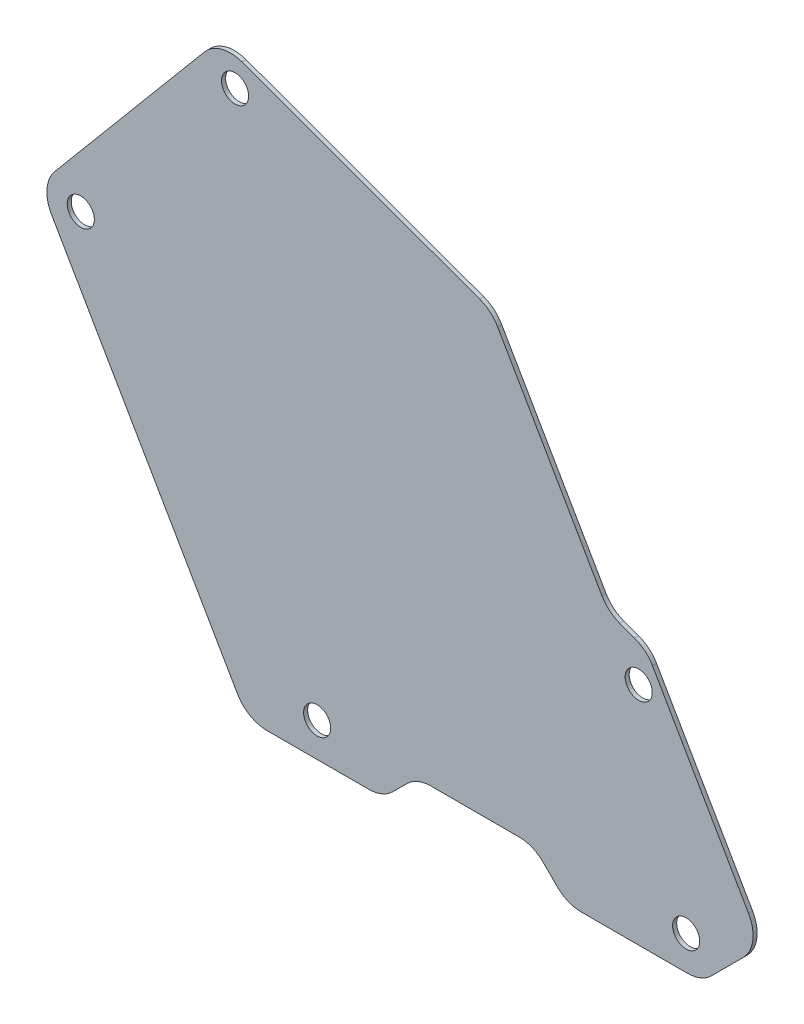
ISO-10303-21;
HEADER;
FILE_DESCRIPTION(('STEP AP214'),'2;1');
FILE_NAME('part.step','',(''),(''),'','','');
FILE_SCHEMA(('AUTOMOTIVE_DESIGN { 1 0 10303 214 1 1 1 1 }'));
ENDSEC;
DATA;
#1=APPLICATION_CONTEXT('core data for automotive mechanical design processes');
#2=APPLICATION_PROTOCOL_DEFINITION('international standard','automotive_design',2000,#1);
#3=PRODUCT_CONTEXT('',#1,'mechanical');
#4=PRODUCT('Part','Part','',(#3));
#5=PRODUCT_RELATED_PRODUCT_CATEGORY('part','',(#4));
#6=PRODUCT_DEFINITION_FORMATION('','',#4);
#7=PRODUCT_DEFINITION_CONTEXT('part definition',#1,'design');
#8=PRODUCT_DEFINITION('design','',#6,#7);
#9=PRODUCT_DEFINITION_SHAPE('','',#8);
#10=(LENGTH_UNIT() NAMED_UNIT(*) SI_UNIT(.MILLI.,.METRE.));
#11=(NAMED_UNIT(*) PLANE_ANGLE_UNIT() SI_UNIT($,.RADIAN.));
#12=(NAMED_UNIT(*) SI_UNIT($,.STERADIAN.) SOLID_ANGLE_UNIT());
#13=UNCERTAINTY_MEASURE_WITH_UNIT(LENGTH_MEASURE(1.E-05),#10,'distance_accuracy_value','');
#14=(GEOMETRIC_REPRESENTATION_CONTEXT(3) GLOBAL_UNCERTAINTY_ASSIGNED_CONTEXT((#13)) GLOBAL_UNIT_ASSIGNED_CONTEXT((#10,
#11,#12)) REPRESENTATION_CONTEXT('',''));
#15=CARTESIAN_POINT('',(0.,0.,0.));
#16=DIRECTION('',(0.,0.,1.));
#17=DIRECTION('',(1.,0.,0.));
#18=AXIS2_PLACEMENT_3D('',#15,#16,#17);
#19=CARTESIAN_POINT('',(332.038625304788,289.359909757789,3.));
#20=DIRECTION('',(0.342020143325669,0.939692620785908,0.));
#21=DIRECTION('',(-0.939692620785909,0.342020143325669,0.));
#22=AXIS2_PLACEMENT_3D('',#19,#20,#21);
#23=PLANE('',#22);
#24=DIRECTION('',(0.939692620785909,-0.342020143325669,0.));
#25=VECTOR('',#24,1.);
#26=CARTESIAN_POINT('',(332.038625304788,289.359909757789,3.));
#27=LINE('',#26,#25);
#28=CARTESIAN_POINT('',(-6.77904359740289,412.679456081648,3.));
#29=VERTEX_POINT('',#28);
#30=CARTESIAN_POINT('',(168.468991560186,348.894387670648,3.));
#31=VERTEX_POINT('',#30);
#32=EDGE_CURVE('E340',#29,#31,#27,.T.);
#33=ORIENTED_EDGE('',*,*,#32,.T.);
#34=DIRECTION('',(0.,0.,-1.));
#35=VECTOR('',#34,1.);
#36=CARTESIAN_POINT('',(168.468991560186,348.894387670648,3.));
#37=LINE('',#36,#35);
#38=CARTESIAN_POINT('',(168.468991560186,348.894387670648,0.));
#39=VERTEX_POINT('',#38);
#40=EDGE_CURVE('E215',#31,#39,#37,.T.);
#41=ORIENTED_EDGE('',*,*,#40,.T.);
#42=DIRECTION('',(0.939692620785909,-0.342020143325669,0.));
#43=VECTOR('',#42,1.);
#44=CARTESIAN_POINT('',(332.038625304788,289.359909757789,0.));
#45=LINE('',#44,#43);
#46=CARTESIAN_POINT('',(-6.77904359740289,412.679456081648,0.));
#47=VERTEX_POINT('',#46);
#48=EDGE_CURVE('E199',#47,#39,#45,.T.);
#49=ORIENTED_EDGE('',*,*,#48,.F.);
#50=DIRECTION('',(0.,0.,-1.));
#51=VECTOR('',#50,1.);
#52=CARTESIAN_POINT('',(-6.77904359740283,412.679456081648,3.));
#53=LINE('',#52,#51);
#54=EDGE_CURVE('E212',#47,#29,#53,.F.);
#55=ORIENTED_EDGE('',*,*,#54,.T.);
#56=EDGE_LOOP('',(#33,#41,#49,#55));
#57=FACE_BOUND('',#56,.T.);
#58=ADVANCED_FACE('F34',(#57),#23,.T.);
#59=CARTESIAN_POINT('',(-345.841153035783,34.1918425614465,3.));
#60=DIRECTION('',(-0.76604444311898,0.642787609686537,0.));
#61=DIRECTION('',(-0.642787609686537,-0.76604444311898,0.));
#62=AXIS2_PLACEMENT_3D('',#59,#60,#61);
#63=PLANE('',#62);
#64=DIRECTION('',(0.642787609686537,0.76604444311898,0.));
#65=VECTOR('',#64,1.);
#66=CARTESIAN_POINT('',(-345.841153035783,34.1918425614465,3.));
#67=LINE('',#66,#65);
#68=CARTESIAN_POINT('',(-144.82852762019,273.749361057275,3.));
#69=VERTEX_POINT('',#68);
#70=CARTESIAN_POINT('',(-34.480658258519,405.256830804164,3.));
#71=VERTEX_POINT('',#70);
#72=EDGE_CURVE('E341',#69,#71,#67,.T.);
#73=ORIENTED_EDGE('',*,*,#72,.T.);
#74=DIRECTION('',(0.,0.,-1.));
#75=VECTOR('',#74,1.);
#76=CARTESIAN_POINT('',(-34.480658258519,405.256830804164,3.));
#77=LINE('',#76,#75);
#78=CARTESIAN_POINT('',(-34.480658258519,405.256830804164,0.));
#79=VERTEX_POINT('',#78);
#80=EDGE_CURVE('E268',#71,#79,#77,.T.);
#81=ORIENTED_EDGE('',*,*,#80,.T.);
#82=DIRECTION('',(0.642787609686537,0.76604444311898,0.));
#83=VECTOR('',#82,1.);
#84=CARTESIAN_POINT('',(-345.841153035783,34.1918425614465,0.));
#85=LINE('',#84,#83);
#86=CARTESIAN_POINT('',(-144.82852762019,273.749361057275,0.));
#87=VERTEX_POINT('',#86);
#88=EDGE_CURVE('E201',#87,#79,#85,.T.);
#89=ORIENTED_EDGE('',*,*,#88,.F.);
#90=DIRECTION('',(0.,0.,-1.));
#91=VECTOR('',#90,1.);
#92=CARTESIAN_POINT('',(-144.82852762019,273.749361057275,3.));
#93=LINE('',#92,#91);
#94=EDGE_CURVE('E266',#87,#69,#93,.F.);
#95=ORIENTED_EDGE('',*,*,#94,.T.);
#96=EDGE_LOOP('',(#73,#81,#89,#95));
#97=FACE_BOUND('',#96,.T.);
#98=ADVANCED_FACE('F416',(#97),#63,.T.);
#99=CARTESIAN_POINT('',(169.267085877925,-303.179192789687,3.));
#100=DIRECTION('',(0.866025403784436,0.500000000000004,0.));
#101=DIRECTION('',(-0.500000000000004,0.866025403784436,0.));
#102=AXIS2_PLACEMENT_3D('',#99,#100,#101);
#103=PLANE('',#102);
#104=DIRECTION('',(0.500000000000004,-0.866025403784436,0.));
#105=VECTOR('',#104,1.);
#106=CARTESIAN_POINT('',(169.267085877925,-303.179192789687,0.));
#107=LINE('',#106,#105);
#108=CARTESIAN_POINT('',(-147.328051636826,245.179670815111,0.));
#109=VERTEX_POINT('',#108);
#110=CARTESIAN_POINT('',(-10.1036297108187,7.4999999999999,0.));
#111=VERTEX_POINT('',#110);
#112=EDGE_CURVE('E375',#109,#111,#107,.T.);
#113=ORIENTED_EDGE('',*,*,#112,.T.);
#114=DIRECTION('',(0.,0.,-1.));
#115=VECTOR('',#114,1.);
#116=CARTESIAN_POINT('',(-10.1036297108187,7.49999999999992,3.));
#117=LINE('',#116,#115);
#118=CARTESIAN_POINT('',(-10.1036297108187,7.4999999999999,3.));
#119=VERTEX_POINT('',#118);
#120=EDGE_CURVE('E278',#111,#119,#117,.F.);
#121=ORIENTED_EDGE('',*,*,#120,.T.);
#122=DIRECTION('',(0.500000000000004,-0.866025403784436,0.));
#123=VECTOR('',#122,1.);
#124=CARTESIAN_POINT('',(169.267085877925,-303.179192789687,3.));
#125=LINE('',#124,#123);
#126=CARTESIAN_POINT('',(-147.328051636826,245.179670815111,3.));
#127=VERTEX_POINT('',#126);
#128=EDGE_CURVE('E344',#127,#119,#125,.T.);
#129=ORIENTED_EDGE('',*,*,#128,.F.);
#130=DIRECTION('',(0.,0.,-1.));
#131=VECTOR('',#130,1.);
#132=CARTESIAN_POINT('',(-147.328051636826,245.179670815111,0.));
#133=LINE('',#132,#131);
#134=EDGE_CURVE('E275',#127,#109,#133,.T.);
#135=ORIENTED_EDGE('',*,*,#134,.T.);
#136=EDGE_LOOP('',(#113,#121,#129,#135));
#137=FACE_BOUND('',#136,.T.);
#138=ADVANCED_FACE('F421',(#137),#103,.F.);
#139=CARTESIAN_POINT('',(102.299593477973,-5.,3.));
#140=DIRECTION('',(0.,-1.,0.));
#141=DIRECTION('',(0.,0.,-1.));
#142=AXIS2_PLACEMENT_3D('',#139,#140,#141);
#143=PLANE('',#142);
#144=DIRECTION('',(-1.,0.,0.));
#145=VECTOR('',#144,1.);
#146=CARTESIAN_POINT('',(102.299593477973,-5.,3.));
#147=LINE('',#146,#145);
#148=CARTESIAN_POINT('',(86.7157287525381,-5.,3.));
#149=VERTEX_POINT('',#148);
#150=CARTESIAN_POINT('',(11.5470053837922,-5.,3.));
#151=VERTEX_POINT('',#150);
#152=EDGE_CURVE('E352',#149,#151,#147,.T.);
#153=ORIENTED_EDGE('',*,*,#152,.T.);
#154=DIRECTION('',(0.,0.,-1.));
#155=VECTOR('',#154,1.);
#156=CARTESIAN_POINT('',(11.5470053837922,-5.,0.));
#157=LINE('',#156,#155);
#158=CARTESIAN_POINT('',(11.5470053837922,-5.,0.));
#159=VERTEX_POINT('',#158);
#160=EDGE_CURVE('E272',#151,#159,#157,.T.);
#161=ORIENTED_EDGE('',*,*,#160,.T.);
#162=DIRECTION('',(-1.,0.,0.));
#163=VECTOR('',#162,1.);
#164=CARTESIAN_POINT('',(102.299593477973,-5.,0.));
#165=LINE('',#164,#163);
#166=CARTESIAN_POINT('',(86.7157287525381,-5.,0.));
#167=VERTEX_POINT('',#166);
#168=EDGE_CURVE('E378',#167,#159,#165,.T.);
#169=ORIENTED_EDGE('',*,*,#168,.F.);
#170=DIRECTION('',(0.,0.,-1.));
#171=VECTOR('',#170,1.);
#172=CARTESIAN_POINT('',(86.7157287525381,-5.,3.));
#173=LINE('',#172,#171);
#174=EDGE_CURVE('E270',#167,#149,#173,.F.);
#175=ORIENTED_EDGE('',*,*,#174,.T.);
#176=EDGE_LOOP('',(#153,#161,#169,#175));
#177=FACE_BOUND('',#176,.T.);
#178=ADVANCED_FACE('F492',(#177),#143,.T.);
#179=CARTESIAN_POINT('',(-68.736115631958,-170.807183443823,3.));
#180=DIRECTION('',(0.707106781186547,-0.707106781186548,0.));
#181=DIRECTION('',(0.707106781186548,0.707106781186547,0.));
#182=AXIS2_PLACEMENT_3D('',#179,#180,#181);
#183=PLANE('',#182);
#184=DIRECTION('',(-0.707106781186548,-0.707106781186547,0.));
#185=VECTOR('',#184,1.);
#186=CARTESIAN_POINT('',(-68.736115631958,-170.807183443823,0.));
#187=LINE('',#186,#185);
#188=CARTESIAN_POINT('',(114.748737341529,12.6776695296637,0.));
#189=VERTEX_POINT('',#188);
#190=CARTESIAN_POINT('',(104.393398282202,2.32233047033631,0.));
#191=VERTEX_POINT('',#190);
#192=EDGE_CURVE('E381',#189,#191,#187,.T.);
#193=ORIENTED_EDGE('',*,*,#192,.F.);
#194=DIRECTION('',(0.,0.,-1.));
#195=VECTOR('',#194,1.);
#196=CARTESIAN_POINT('',(114.748737341529,12.6776695296637,3.));
#197=LINE('',#196,#195);
#198=CARTESIAN_POINT('',(114.748737341529,12.6776695296637,3.));
#199=VERTEX_POINT('',#198);
#200=EDGE_CURVE('E288',#189,#199,#197,.F.);
#201=ORIENTED_EDGE('',*,*,#200,.T.);
#202=DIRECTION('',(-0.707106781186548,-0.707106781186547,0.));
#203=VECTOR('',#202,1.);
#204=CARTESIAN_POINT('',(-68.736115631958,-170.807183443823,3.));
#205=LINE('',#204,#203);
#206=CARTESIAN_POINT('',(104.393398282202,2.32233047033631,3.));
#207=VERTEX_POINT('',#206);
#208=EDGE_CURVE('E355',#199,#207,#205,.T.);
#209=ORIENTED_EDGE('',*,*,#208,.T.);
#210=DIRECTION('',(0.,0.,-1.));
#211=VECTOR('',#210,1.);
#212=CARTESIAN_POINT('',(104.393398282202,2.32233047033631,3.));
#213=LINE('',#212,#211);
#214=EDGE_CURVE('E285',#207,#191,#213,.T.);
#215=ORIENTED_EDGE('',*,*,#214,.T.);
#216=EDGE_LOOP('',(#193,#201,#209,#215));
#217=FACE_BOUND('',#216,.T.);
#218=ADVANCED_FACE('F485',(#217),#183,.T.);
#219=CARTESIAN_POINT('',(102.299593477973,20.,3.));
#220=DIRECTION('',(0.,-1.,0.));
#221=DIRECTION('',(0.,0.,-1.));
#222=AXIS2_PLACEMENT_3D('',#219,#220,#221);
#223=PLANE('',#222);
#224=DIRECTION('',(-1.,0.,0.));
#225=VECTOR('',#224,1.);
#226=CARTESIAN_POINT('',(102.299593477973,20.,3.));
#227=LINE('',#226,#225);
#228=CARTESIAN_POINT('',(197.573593128807,20.,3.));
#229=VERTEX_POINT('',#228);
#230=CARTESIAN_POINT('',(132.426406871193,20.,3.));
#231=VERTEX_POINT('',#230);
#232=EDGE_CURVE('E358',#229,#231,#227,.T.);
#233=ORIENTED_EDGE('',*,*,#232,.T.);
#234=DIRECTION('',(0.,0.,-1.));
#235=VECTOR('',#234,1.);
#236=CARTESIAN_POINT('',(132.426406871193,20.,0.));
#237=LINE('',#236,#235);
#238=CARTESIAN_POINT('',(132.426406871193,20.,0.));
#239=VERTEX_POINT('',#238);
#240=EDGE_CURVE('E282',#231,#239,#237,.T.);
#241=ORIENTED_EDGE('',*,*,#240,.T.);
#242=DIRECTION('',(-1.,0.,0.));
#243=VECTOR('',#242,1.);
#244=CARTESIAN_POINT('',(102.299593477973,20.,0.));
#245=LINE('',#244,#243);
#246=CARTESIAN_POINT('',(197.573593128807,20.,0.));
#247=VERTEX_POINT('',#246);
#248=EDGE_CURVE('E384',#247,#239,#245,.T.);
#249=ORIENTED_EDGE('',*,*,#248,.F.);
#250=DIRECTION('',(0.,0.,-1.));
#251=VECTOR('',#250,1.);
#252=CARTESIAN_POINT('',(197.573593128807,20.,3.));
#253=LINE('',#252,#251);
#254=EDGE_CURVE('E280',#247,#229,#253,.F.);
#255=ORIENTED_EDGE('',*,*,#254,.T.);
#256=EDGE_LOOP('',(#233,#241,#249,#255));
#257=FACE_BOUND('',#256,.T.);
#258=ADVANCED_FACE('F478',(#257),#223,.T.);
#259=CARTESIAN_POINT('',(336.035709109931,-108.106776921796,3.));
#260=DIRECTION('',(0.707106781186547,0.707106781186548,0.));
#261=DIRECTION('',(-0.707106781186548,0.707106781186547,0.));
#262=AXIS2_PLACEMENT_3D('',#259,#260,#261);
#263=PLANE('',#262);
#264=DIRECTION('',(0.707106781186548,-0.707106781186547,0.));
#265=VECTOR('',#264,1.);
#266=CARTESIAN_POINT('',(336.035709109931,-108.106776921796,3.));
#267=LINE('',#266,#265);
#268=CARTESIAN_POINT('',(215.251262658471,12.6776695296637,3.));
#269=VERTEX_POINT('',#268);
#270=CARTESIAN_POINT('',(225.606601717798,2.32233047033632,3.));
#271=VERTEX_POINT('',#270);
#272=EDGE_CURVE('E361',#269,#271,#267,.T.);
#273=ORIENTED_EDGE('',*,*,#272,.F.);
#274=DIRECTION('',(0.,0.,-1.));
#275=VECTOR('',#274,1.);
#276=CARTESIAN_POINT('',(215.251262658471,12.6776695296637,3.));
#277=LINE('',#276,#275);
#278=CARTESIAN_POINT('',(215.251262658471,12.6776695296637,0.));
#279=VERTEX_POINT('',#278);
#280=EDGE_CURVE('E292',#269,#279,#277,.T.);
#281=ORIENTED_EDGE('',*,*,#280,.T.);
#282=DIRECTION('',(0.707106781186548,-0.707106781186547,0.));
#283=VECTOR('',#282,1.);
#284=CARTESIAN_POINT('',(336.035709109931,-108.106776921796,0.));
#285=LINE('',#284,#283);
#286=CARTESIAN_POINT('',(225.606601717798,2.32233047033632,0.));
#287=VERTEX_POINT('',#286);
#288=EDGE_CURVE('E387',#279,#287,#285,.T.);
#289=ORIENTED_EDGE('',*,*,#288,.T.);
#290=DIRECTION('',(0.,0.,-1.));
#291=VECTOR('',#290,1.);
#292=CARTESIAN_POINT('',(225.606601717798,2.32233047033629,3.));
#293=LINE('',#292,#291);
#294=EDGE_CURVE('E290',#287,#271,#293,.F.);
#295=ORIENTED_EDGE('',*,*,#294,.T.);
#296=EDGE_LOOP('',(#273,#281,#289,#295));
#297=FACE_BOUND('',#296,.T.);
#298=ADVANCED_FACE('F472',(#297),#263,.F.);
#299=CARTESIAN_POINT('',(102.299593477973,-5.,3.));
#300=DIRECTION('',(0.,-1.,0.));
#301=DIRECTION('',(1.,0.,0.));
#302=AXIS2_PLACEMENT_3D('',#299,#300,#301);
#303=PLANE('',#302);
#304=DIRECTION('',(-1.,0.,0.));
#305=VECTOR('',#304,1.);
#306=CARTESIAN_POINT('',(102.299593477973,-5.,3.));
#307=LINE('',#306,#305);
#308=CARTESIAN_POINT('',(321.715728752538,-5.,3.));
#309=VERTEX_POINT('',#308);
#310=CARTESIAN_POINT('',(243.284271247462,-5.,3.));
#311=VERTEX_POINT('',#310);
#312=EDGE_CURVE('E364',#309,#311,#307,.T.);
#313=ORIENTED_EDGE('',*,*,#312,.T.);
#314=DIRECTION('',(0.,0.,-1.));
#315=VECTOR('',#314,1.);
#316=CARTESIAN_POINT('',(243.284271247462,-5.,0.));
#317=LINE('',#316,#315);
#318=CARTESIAN_POINT('',(243.284271247462,-5.,0.));
#319=VERTEX_POINT('',#318);
#320=EDGE_CURVE('E297',#311,#319,#317,.T.);
#321=ORIENTED_EDGE('',*,*,#320,.T.);
#322=DIRECTION('',(-1.,0.,0.));
#323=VECTOR('',#322,1.);
#324=CARTESIAN_POINT('',(102.299593477973,-5.,0.));
#325=LINE('',#324,#323);
#326=CARTESIAN_POINT('',(321.715728752538,-5.,0.));
#327=VERTEX_POINT('',#326);
#328=EDGE_CURVE('E390',#327,#319,#325,.T.);
#329=ORIENTED_EDGE('',*,*,#328,.F.);
#330=DIRECTION('',(0.,0.,-1.));
#331=VECTOR('',#330,1.);
#332=CARTESIAN_POINT('',(321.715728752538,-5.,3.));
#333=LINE('',#332,#331);
#334=EDGE_CURVE('E295',#327,#309,#333,.F.);
#335=ORIENTED_EDGE('',*,*,#334,.T.);
#336=EDGE_LOOP('',(#313,#321,#329,#335));
#337=FACE_BOUND('',#336,.T.);
#338=ADVANCED_FACE('F465',(#337),#303,.T.);
#339=CARTESIAN_POINT('',(48.763884368042,-288.307183443823,3.));
#340=DIRECTION('',(0.707106781186547,-0.707106781186547,0.));
#341=DIRECTION('',(0.707106781186548,0.707106781186548,0.));
#342=AXIS2_PLACEMENT_3D('',#339,#340,#341);
#343=PLANE('',#342);
#344=DIRECTION('',(-0.707106781186548,-0.707106781186548,0.));
#345=VECTOR('',#344,1.);
#346=CARTESIAN_POINT('',(48.763884368042,-288.307183443823,3.));
#347=LINE('',#346,#345);
#348=CARTESIAN_POINT('',(362.683891574185,25.6128237623193,3.));
#349=VERTEX_POINT('',#348);
#350=CARTESIAN_POINT('',(339.393398282202,2.32233047033636,3.));
#351=VERTEX_POINT('',#350);
#352=EDGE_CURVE('E367',#349,#351,#347,.T.);
#353=ORIENTED_EDGE('',*,*,#352,.T.);
#354=DIRECTION('',(0.,0.,-1.));
#355=VECTOR('',#354,1.);
#356=CARTESIAN_POINT('',(339.393398282202,2.32233047033631,3.));
#357=LINE('',#356,#355);
#358=CARTESIAN_POINT('',(339.393398282202,2.32233047033636,0.));
#359=VERTEX_POINT('',#358);
#360=EDGE_CURVE('E302',#351,#359,#357,.T.);
#361=ORIENTED_EDGE('',*,*,#360,.T.);
#362=DIRECTION('',(-0.707106781186548,-0.707106781186548,0.));
#363=VECTOR('',#362,1.);
#364=CARTESIAN_POINT('',(48.763884368042,-288.307183443823,0.));
#365=LINE('',#364,#363);
#366=CARTESIAN_POINT('',(362.683891574185,25.6128237623193,0.));
#367=VERTEX_POINT('',#366);
#368=EDGE_CURVE('E393',#367,#359,#365,.T.);
#369=ORIENTED_EDGE('',*,*,#368,.F.);
#370=DIRECTION('',(0.,0.,-1.));
#371=VECTOR('',#370,1.);
#372=CARTESIAN_POINT('',(362.683891574185,25.6128237623192,3.));
#373=LINE('',#372,#371);
#374=EDGE_CURVE('E300',#367,#349,#373,.F.);
#375=ORIENTED_EDGE('',*,*,#374,.T.);
#376=EDGE_LOOP('',(#353,#361,#369,#375));
#377=FACE_BOUND('',#376,.T.);
#378=ADVANCED_FACE('F461',(#377),#343,.T.);
#379=CARTESIAN_POINT('',(472.747847991456,-127.964493089567,3.));
#380=DIRECTION('',(0.866025403784438,0.5,0.));
#381=DIRECTION('',(-0.5,0.866025403784439,0.));
#382=AXIS2_PLACEMENT_3D('',#379,#380,#381);
#383=PLANE('',#382);
#384=DIRECTION('',(0.5,-0.866025403784438,0.));
#385=VECTOR('',#384,1.);
#386=CARTESIAN_POINT('',(472.747847991456,-127.964493089567,3.));
#387=LINE('',#386,#385);
#388=CARTESIAN_POINT('',(295.799341808877,178.519309942074,3.));
#389=VERTEX_POINT('',#388);
#390=CARTESIAN_POINT('',(366.656857139132,55.7904932919829,3.));
#391=VERTEX_POINT('',#390);
#392=EDGE_CURVE('E370',#389,#391,#387,.T.);
#393=ORIENTED_EDGE('',*,*,#392,.T.);
#394=DIRECTION('',(0.,0.,-1.));
#395=VECTOR('',#394,1.);
#396=CARTESIAN_POINT('',(366.656857139132,55.790493291983,3.));
#397=LINE('',#396,#395);
#398=CARTESIAN_POINT('',(366.656857139132,55.7904932919829,0.));
#399=VERTEX_POINT('',#398);
#400=EDGE_CURVE('E307',#391,#399,#397,.T.);
#401=ORIENTED_EDGE('',*,*,#400,.T.);
#402=DIRECTION('',(0.5,-0.866025403784438,0.));
#403=VECTOR('',#402,1.);
#404=CARTESIAN_POINT('',(472.747847991456,-127.964493089567,0.));
#405=LINE('',#404,#403);
#406=CARTESIAN_POINT('',(295.799341808877,178.519309942074,0.));
#407=VERTEX_POINT('',#406);
#408=EDGE_CURVE('E329',#407,#399,#405,.T.);
#409=ORIENTED_EDGE('',*,*,#408,.F.);
#410=DIRECTION('',(0.,0.,-1.));
#411=VECTOR('',#410,1.);
#412=CARTESIAN_POINT('',(295.799341808877,178.519309942074,3.));
#413=LINE('',#412,#411);
#414=EDGE_CURVE('E305',#407,#389,#413,.F.);
#415=ORIENTED_EDGE('',*,*,#414,.T.);
#416=EDGE_LOOP('',(#393,#401,#409,#415));
#417=FACE_BOUND('',#416,.T.);
#418=ADVANCED_FACE('F401',(#417),#383,.T.);
#419=CARTESIAN_POINT('',(294.176390150685,185.334273621809,3.));
#420=DIRECTION('',(0.342020143325669,0.939692620785908,0.));
#421=DIRECTION('',(-0.939692620785909,0.342020143325669,0.));
#422=AXIS2_PLACEMENT_3D('',#419,#420,#421);
#423=PLANE('',#422);
#424=DIRECTION('',(0.939692620785909,-0.342020143325669,0.));
#425=VECTOR('',#424,1.);
#426=CARTESIAN_POINT('',(294.176390150685,185.334273621809,3.));
#427=LINE('',#426,#425);
#428=CARTESIAN_POINT('',(271.680689159319,193.522039181619,3.));
#429=VERTEX_POINT('',#428);
#430=CARTESIAN_POINT('',(282.699210297408,189.511625461722,3.));
#431=VERTEX_POINT('',#430);
#432=EDGE_CURVE('E226',#429,#431,#427,.T.);
#433=ORIENTED_EDGE('',*,*,#432,.T.);
#434=DIRECTION('',(0.,0.,-1.));
#435=VECTOR('',#434,1.);
#436=CARTESIAN_POINT('',(282.699210297408,189.511625461722,3.));
#437=LINE('',#436,#435);
#438=CARTESIAN_POINT('',(282.699210297408,189.511625461722,0.));
#439=VERTEX_POINT('',#438);
#440=EDGE_CURVE('E311',#431,#439,#437,.T.);
#441=ORIENTED_EDGE('',*,*,#440,.T.);
#442=DIRECTION('',(0.939692620785909,-0.342020143325669,0.));
#443=VECTOR('',#442,1.);
#444=CARTESIAN_POINT('',(294.176390150685,185.334273621809,0.));
#445=LINE('',#444,#443);
#446=CARTESIAN_POINT('',(271.680689159319,193.522039181619,0.));
#447=VERTEX_POINT('',#446);
#448=EDGE_CURVE('E323',#447,#439,#445,.T.);
#449=ORIENTED_EDGE('',*,*,#448,.F.);
#450=DIRECTION('',(0.,0.,-1.));
#451=VECTOR('',#450,1.);
#452=CARTESIAN_POINT('',(271.680689159319,193.522039181619,3.));
#453=LINE('',#452,#451);
#454=EDGE_CURVE('E56',#447,#429,#453,.F.);
#455=ORIENTED_EDGE('',*,*,#454,.T.);
#456=EDGE_LOOP('',(#433,#441,#449,#455));
#457=FACE_BOUND('',#456,.T.);
#458=ADVANCED_FACE('F327',(#457),#423,.T.);
#459=CARTESIAN_POINT('',(456.089944437673,-137.581938190476,3.));
#460=DIRECTION('',(0.866025403784436,0.500000000000004,0.));
#461=DIRECTION('',(-0.500000000000004,0.866025403784436,0.));
#462=AXIS2_PLACEMENT_3D('',#459,#460,#461);
#463=PLANE('',#462);
#464=DIRECTION('',(0.500000000000004,-0.866025403784436,0.));
#465=VECTOR('',#464,1.);
#466=CARTESIAN_POINT('',(456.089944437673,-137.581938190476,0.));
#467=LINE('',#466,#465);
#468=CARTESIAN_POINT('',(181.569123071656,337.902072151001,0.));
#469=VERTEX_POINT('',#468);
#470=CARTESIAN_POINT('',(258.58055764785,204.514354701267,0.));
#471=VERTEX_POINT('',#470);
#472=EDGE_CURVE('E229',#469,#471,#467,.T.);
#473=ORIENTED_EDGE('',*,*,#472,.F.);
#474=DIRECTION('',(0.,0.,-1.));
#475=VECTOR('',#474,1.);
#476=CARTESIAN_POINT('',(181.569123071656,337.902072151001,3.));
#477=LINE('',#476,#475);
#478=CARTESIAN_POINT('',(181.569123071656,337.902072151001,3.));
#479=VERTEX_POINT('',#478);
#480=EDGE_CURVE('E248',#469,#479,#477,.F.);
#481=ORIENTED_EDGE('',*,*,#480,.T.);
#482=DIRECTION('',(0.500000000000004,-0.866025403784436,0.));
#483=VECTOR('',#482,1.);
#484=CARTESIAN_POINT('',(456.089944437673,-137.581938190476,3.));
#485=LINE('',#484,#483);
#486=CARTESIAN_POINT('',(258.58055764785,204.514354701267,3.));
#487=VERTEX_POINT('',#486);
#488=EDGE_CURVE('E221',#479,#487,#485,.T.);
#489=ORIENTED_EDGE('',*,*,#488,.T.);
#490=DIRECTION('',(0.,0.,-1.));
#491=VECTOR('',#490,1.);
#492=CARTESIAN_POINT('',(258.58055764785,204.514354701267,0.));
#493=LINE('',#492,#491);
#494=EDGE_CURVE('E245',#487,#471,#493,.T.);
#495=ORIENTED_EDGE('',*,*,#494,.T.);
#496=EDGE_LOOP('',(#473,#481,#489,#495));
#497=FACE_BOUND('',#496,.T.);
#498=ADVANCED_FACE('F336',(#497),#463,.T.);
#499=CARTESIAN_POINT('',(102.299593477973,-341.842892553754,3.));
#500=DIRECTION('',(0.,0.,1.));
#501=DIRECTION('',(1.,0.,0.));
#502=AXIS2_PLACEMENT_3D('',#499,#500,#501);
#503=PLANE('',#502);
#504=CARTESIAN_POINT('',(285.6738468369,161.319502664671,3.));
#505=DIRECTION('',(0.,0.,-1.));
#506=DIRECTION('',(-1.,0.,0.));
#507=AXIS2_PLACEMENT_3D('',#504,#505,#506);
#508=CIRCLE('',#507,10.);
#509=CARTESIAN_POINT('',(275.6738468369,161.319502664671,3.));
#510=VERTEX_POINT('',#509);
#511=EDGE_CURVE('E692',#510,#510,#508,.T.);
#512=ORIENTED_EDGE('',*,*,#511,.T.);
#513=EDGE_LOOP('',(#512));
#514=FACE_BOUND('',#513,.T.);
#515=CARTESIAN_POINT('',(320.6738468369,20.,3.));
#516=DIRECTION('',(0.,0.,-1.));
#517=DIRECTION('',(-1.,0.,0.));
#518=AXIS2_PLACEMENT_3D('',#515,#516,#517);
#519=CIRCLE('',#518,9.99999999999998);
#520=CARTESIAN_POINT('',(310.6738468369,20.,3.));
#521=VERTEX_POINT('',#520);
#522=EDGE_CURVE('E700',#521,#521,#519,.T.);
#523=ORIENTED_EDGE('',*,*,#522,.T.);
#524=EDGE_LOOP('',(#523));
#525=FACE_BOUND('',#524,.T.);
#526=CARTESIAN_POINT('',(48.610426110346,20.,3.));
#527=DIRECTION('',(0.,0.,-1.));
#528=DIRECTION('',(-1.,0.,0.));
#529=AXIS2_PLACEMENT_3D('',#526,#527,#528);
#530=CIRCLE('',#529,10.);
#531=CARTESIAN_POINT('',(38.610426110346,20.,3.));
#532=VERTEX_POINT('',#531);
#533=EDGE_CURVE('E706',#532,#532,#530,.T.);
#534=ORIENTED_EDGE('',*,*,#533,.T.);
#535=EDGE_LOOP('',(#534));
#536=FACE_BOUND('',#535,.T.);
#537=CARTESIAN_POINT('',(-125.677416542216,257.679670815111,3.));
#538=DIRECTION('',(0.,0.,-1.));
#539=DIRECTION('',(-1.,0.,0.));
#540=AXIS2_PLACEMENT_3D('',#537,#538,#539);
#541=CIRCLE('',#540,10.);
#542=CARTESIAN_POINT('',(-135.677416542216,257.679670815111,3.));
#543=VERTEX_POINT('',#542);
#544=EDGE_CURVE('E712',#543,#543,#541,.T.);
#545=ORIENTED_EDGE('',*,*,#544,.T.);
#546=EDGE_LOOP('',(#545));
#547=FACE_BOUND('',#546,.T.);
#548=CARTESIAN_POINT('',(-11.9093457472882,393.26317790748,3.));
#549=DIRECTION('',(0.,0.,-1.));
#550=DIRECTION('',(-1.,0.,0.));
#551=AXIS2_PLACEMENT_3D('',#548,#549,#550);
#552=CIRCLE('',#551,10.);
#553=CARTESIAN_POINT('',(-21.9093457472882,393.26317790748,3.));
#554=VERTEX_POINT('',#553);
#555=EDGE_CURVE('E216',#554,#554,#552,.T.);
#556=ORIENTED_EDGE('',*,*,#555,.T.);
#557=EDGE_LOOP('',(#556));
#558=FACE_BOUND('',#557,.T.);
#559=ORIENTED_EDGE('',*,*,#488,.F.);
#560=CARTESIAN_POINT('',(159.918487977045,325.402072151001,3.));
#561=DIRECTION('',(0.,0.,1.));
#562=DIRECTION('',(1.,0.,0.));
#563=AXIS2_PLACEMENT_3D('',#560,#561,#562);
#564=CIRCLE('',#563,25.);
#565=EDGE_CURVE('E264',#479,#31,#564,.T.);
#566=ORIENTED_EDGE('',*,*,#565,.T.);
#567=ORIENTED_EDGE('',*,*,#32,.F.);
#568=CARTESIAN_POINT('',(-15.3295471805445,389.187140562,3.));
#569=DIRECTION('',(0.,0.,1.));
#570=DIRECTION('',(1.,0.,0.));
#571=AXIS2_PLACEMENT_3D('',#568,#569,#570);
#572=CIRCLE('',#571,25.);
#573=EDGE_CURVE('E220',#29,#71,#572,.T.);
#574=ORIENTED_EDGE('',*,*,#573,.T.);
#575=ORIENTED_EDGE('',*,*,#72,.F.);
#576=CARTESIAN_POINT('',(-125.677416542215,257.679670815111,3.));
#577=DIRECTION('',(0.,0.,1.));
#578=DIRECTION('',(1.,0.,0.));
#579=AXIS2_PLACEMENT_3D('',#576,#577,#578);
#580=CIRCLE('',#579,25.);
#581=EDGE_CURVE('E250',#69,#127,#580,.T.);
#582=ORIENTED_EDGE('',*,*,#581,.T.);
#583=ORIENTED_EDGE('',*,*,#128,.T.);
#584=CARTESIAN_POINT('',(11.5470053837922,20.,3.));
#585=DIRECTION('',(0.,0.,1.));
#586=DIRECTION('',(1.,0.,0.));
#587=AXIS2_PLACEMENT_3D('',#584,#585,#586);
#588=CIRCLE('',#587,25.);
#589=EDGE_CURVE('E261',#119,#151,#588,.T.);
#590=ORIENTED_EDGE('',*,*,#589,.T.);
#591=ORIENTED_EDGE('',*,*,#152,.F.);
#592=CARTESIAN_POINT('',(86.7157287525381,20.,3.));
#593=DIRECTION('',(0.,0.,1.));
#594=DIRECTION('',(1.,0.,0.));
#595=AXIS2_PLACEMENT_3D('',#592,#593,#594);
#596=CIRCLE('',#595,25.);
#597=EDGE_CURVE('E259',#149,#207,#596,.T.);
#598=ORIENTED_EDGE('',*,*,#597,.T.);
#599=ORIENTED_EDGE('',*,*,#208,.F.);
#600=CARTESIAN_POINT('',(132.426406871193,-4.99999999999998,3.));
#601=DIRECTION('',(0.,0.,1.));
#602=DIRECTION('',(1.,0.,0.));
#603=AXIS2_PLACEMENT_3D('',#600,#601,#602);
#604=CIRCLE('',#603,25.);
#605=EDGE_CURVE('E316',#199,#231,#604,.F.);
#606=ORIENTED_EDGE('',*,*,#605,.T.);
#607=ORIENTED_EDGE('',*,*,#232,.F.);
#608=CARTESIAN_POINT('',(197.573593128807,-4.99999999999998,3.));
#609=DIRECTION('',(0.,0.,1.));
#610=DIRECTION('',(1.,0.,0.));
#611=AXIS2_PLACEMENT_3D('',#608,#609,#610);
#612=CIRCLE('',#611,25.);
#613=EDGE_CURVE('E320',#229,#269,#612,.F.);
#614=ORIENTED_EDGE('',*,*,#613,.T.);
#615=ORIENTED_EDGE('',*,*,#272,.T.);
#616=CARTESIAN_POINT('',(243.284271247462,20.,3.));
#617=DIRECTION('',(0.,0.,1.));
#618=DIRECTION('',(1.,0.,0.));
#619=AXIS2_PLACEMENT_3D('',#616,#617,#618);
#620=CIRCLE('',#619,25.);
#621=EDGE_CURVE('E257',#271,#311,#620,.T.);
#622=ORIENTED_EDGE('',*,*,#621,.T.);
#623=ORIENTED_EDGE('',*,*,#312,.F.);
#624=CARTESIAN_POINT('',(321.715728752538,20.,3.));
#625=DIRECTION('',(0.,0.,1.));
#626=DIRECTION('',(1.,0.,0.));
#627=AXIS2_PLACEMENT_3D('',#624,#625,#626);
#628=CIRCLE('',#627,25.);
#629=EDGE_CURVE('E255',#309,#351,#628,.T.);
#630=ORIENTED_EDGE('',*,*,#629,.T.);
#631=ORIENTED_EDGE('',*,*,#352,.F.);
#632=CARTESIAN_POINT('',(345.006222044521,43.2904932919829,3.));
#633=DIRECTION('',(0.,0.,1.));
#634=DIRECTION('',(1.,0.,0.));
#635=AXIS2_PLACEMENT_3D('',#632,#633,#634);
#636=CIRCLE('',#635,25.);
#637=EDGE_CURVE('E253',#349,#391,#636,.T.);
#638=ORIENTED_EDGE('',*,*,#637,.T.);
#639=ORIENTED_EDGE('',*,*,#392,.F.);
#640=CARTESIAN_POINT('',(274.148706714266,166.019309942074,3.));
#641=DIRECTION('',(0.,0.,1.));
#642=DIRECTION('',(1.,0.,0.));
#643=AXIS2_PLACEMENT_3D('',#640,#641,#642);
#644=CIRCLE('',#643,25.);
#645=EDGE_CURVE('E49',#389,#431,#644,.T.);
#646=ORIENTED_EDGE('',*,*,#645,.T.);
#647=ORIENTED_EDGE('',*,*,#432,.F.);
#648=CARTESIAN_POINT('',(280.231192742461,217.014354701267,3.));
#649=DIRECTION('',(0.,0.,1.));
#650=DIRECTION('',(1.,0.,0.));
#651=AXIS2_PLACEMENT_3D('',#648,#649,#650);
#652=CIRCLE('',#651,25.);
#653=EDGE_CURVE('E11',#429,#487,#652,.F.);
#654=ORIENTED_EDGE('',*,*,#653,.T.);
#655=EDGE_LOOP('',(#559,#566,#567,#574,#575,#582,#583,#590,#591,#598,#599,#606,#607,#614,#615,
#622,#623,#630,#631,#638,#639,#646,#647,#654));
#656=FACE_BOUND('',#655,.T.);
#657=ADVANCED_FACE('F333',(#514,#525,#536,#547,#558,#656),#503,.T.);
#658=CARTESIAN_POINT('',(102.299593477973,-341.842892553754,0.));
#659=DIRECTION('',(0.,0.,1.));
#660=DIRECTION('',(1.,0.,0.));
#661=AXIS2_PLACEMENT_3D('',#658,#659,#660);
#662=PLANE('',#661);
#663=CARTESIAN_POINT('',(285.6738468369,161.319502664671,0.));
#664=DIRECTION('',(0.,0.,-1.));
#665=DIRECTION('',(-1.,0.,0.));
#666=AXIS2_PLACEMENT_3D('',#663,#664,#665);
#667=CIRCLE('',#666,10.);
#668=CARTESIAN_POINT('',(275.6738468369,161.319502664671,0.));
#669=VERTEX_POINT('',#668);
#670=EDGE_CURVE('E695',#669,#669,#667,.T.);
#671=ORIENTED_EDGE('',*,*,#670,.F.);
#672=EDGE_LOOP('',(#671));
#673=FACE_BOUND('',#672,.T.);
#674=CARTESIAN_POINT('',(320.6738468369,20.,0.));
#675=DIRECTION('',(0.,0.,-1.));
#676=DIRECTION('',(-1.,0.,0.));
#677=AXIS2_PLACEMENT_3D('',#674,#675,#676);
#678=CIRCLE('',#677,9.99999999999998);
#679=CARTESIAN_POINT('',(310.6738468369,20.,0.));
#680=VERTEX_POINT('',#679);
#681=EDGE_CURVE('E697',#680,#680,#678,.T.);
#682=ORIENTED_EDGE('',*,*,#681,.F.);
#683=EDGE_LOOP('',(#682));
#684=FACE_BOUND('',#683,.T.);
#685=CARTESIAN_POINT('',(48.610426110346,20.,0.));
#686=DIRECTION('',(0.,0.,-1.));
#687=DIRECTION('',(-1.,0.,0.));
#688=AXIS2_PLACEMENT_3D('',#685,#686,#687);
#689=CIRCLE('',#688,10.);
#690=CARTESIAN_POINT('',(38.610426110346,20.,0.));
#691=VERTEX_POINT('',#690);
#692=EDGE_CURVE('E703',#691,#691,#689,.T.);
#693=ORIENTED_EDGE('',*,*,#692,.F.);
#694=EDGE_LOOP('',(#693));
#695=FACE_BOUND('',#694,.T.);
#696=CARTESIAN_POINT('',(-125.677416542216,257.679670815111,0.));
#697=DIRECTION('',(0.,0.,-1.));
#698=DIRECTION('',(-1.,0.,0.));
#699=AXIS2_PLACEMENT_3D('',#696,#697,#698);
#700=CIRCLE('',#699,10.);
#701=CARTESIAN_POINT('',(-135.677416542216,257.679670815111,0.));
#702=VERTEX_POINT('',#701);
#703=EDGE_CURVE('E709',#702,#702,#700,.T.);
#704=ORIENTED_EDGE('',*,*,#703,.F.);
#705=EDGE_LOOP('',(#704));
#706=FACE_BOUND('',#705,.T.);
#707=CARTESIAN_POINT('',(-11.9093457472882,393.26317790748,0.));
#708=DIRECTION('',(0.,0.,-1.));
#709=DIRECTION('',(-1.,0.,0.));
#710=AXIS2_PLACEMENT_3D('',#707,#708,#709);
#711=CIRCLE('',#710,10.);
#712=CARTESIAN_POINT('',(-21.9093457472882,393.26317790748,0.));
#713=VERTEX_POINT('',#712);
#714=EDGE_CURVE('E347',#713,#713,#711,.T.);
#715=ORIENTED_EDGE('',*,*,#714,.F.);
#716=EDGE_LOOP('',(#715));
#717=FACE_BOUND('',#716,.T.);
#718=ORIENTED_EDGE('',*,*,#48,.T.);
#719=CARTESIAN_POINT('',(159.918487977045,325.402072151001,0.));
#720=DIRECTION('',(0.,0.,1.));
#721=DIRECTION('',(1.,0.,0.));
#722=AXIS2_PLACEMENT_3D('',#719,#720,#721);
#723=CIRCLE('',#722,25.);
#724=EDGE_CURVE('E206',#39,#469,#723,.F.);
#725=ORIENTED_EDGE('',*,*,#724,.T.);
#726=ORIENTED_EDGE('',*,*,#472,.T.);
#727=CARTESIAN_POINT('',(280.231192742461,217.014354701267,0.));
#728=DIRECTION('',(0.,0.,1.));
#729=DIRECTION('',(1.,0.,0.));
#730=AXIS2_PLACEMENT_3D('',#727,#728,#729);
#731=CIRCLE('',#730,25.);
#732=EDGE_CURVE('E42',#471,#447,#731,.T.);
#733=ORIENTED_EDGE('',*,*,#732,.T.);
#734=ORIENTED_EDGE('',*,*,#448,.T.);
#735=CARTESIAN_POINT('',(274.148706714266,166.019309942074,0.));
#736=DIRECTION('',(0.,0.,1.));
#737=DIRECTION('',(1.,0.,0.));
#738=AXIS2_PLACEMENT_3D('',#735,#736,#737);
#739=CIRCLE('',#738,25.);
#740=EDGE_CURVE('E233',#439,#407,#739,.F.);
#741=ORIENTED_EDGE('',*,*,#740,.T.);
#742=ORIENTED_EDGE('',*,*,#408,.T.);
#743=CARTESIAN_POINT('',(345.006222044521,43.2904932919829,0.));
#744=DIRECTION('',(0.,0.,1.));
#745=DIRECTION('',(1.,0.,0.));
#746=AXIS2_PLACEMENT_3D('',#743,#744,#745);
#747=CIRCLE('',#746,25.);
#748=EDGE_CURVE('E235',#399,#367,#747,.F.);
#749=ORIENTED_EDGE('',*,*,#748,.T.);
#750=ORIENTED_EDGE('',*,*,#368,.T.);
#751=CARTESIAN_POINT('',(321.715728752538,20.,0.));
#752=DIRECTION('',(0.,0.,1.));
#753=DIRECTION('',(1.,0.,0.));
#754=AXIS2_PLACEMENT_3D('',#751,#752,#753);
#755=CIRCLE('',#754,25.);
#756=EDGE_CURVE('E237',#359,#327,#755,.F.);
#757=ORIENTED_EDGE('',*,*,#756,.T.);
#758=ORIENTED_EDGE('',*,*,#328,.T.);
#759=CARTESIAN_POINT('',(243.284271247462,20.,0.));
#760=DIRECTION('',(0.,0.,1.));
#761=DIRECTION('',(1.,0.,0.));
#762=AXIS2_PLACEMENT_3D('',#759,#760,#761);
#763=CIRCLE('',#762,25.);
#764=EDGE_CURVE('E239',#319,#287,#763,.F.);
#765=ORIENTED_EDGE('',*,*,#764,.T.);
#766=ORIENTED_EDGE('',*,*,#288,.F.);
#767=CARTESIAN_POINT('',(197.573593128807,-4.99999999999998,0.));
#768=DIRECTION('',(0.,0.,1.));
#769=DIRECTION('',(1.,0.,0.));
#770=AXIS2_PLACEMENT_3D('',#767,#768,#769);
#771=CIRCLE('',#770,25.);
#772=EDGE_CURVE('E318',#279,#247,#771,.T.);
#773=ORIENTED_EDGE('',*,*,#772,.T.);
#774=ORIENTED_EDGE('',*,*,#248,.T.);
#775=CARTESIAN_POINT('',(132.426406871193,-4.99999999999998,0.));
#776=DIRECTION('',(0.,0.,1.));
#777=DIRECTION('',(1.,0.,0.));
#778=AXIS2_PLACEMENT_3D('',#775,#776,#777);
#779=CIRCLE('',#778,25.);
#780=EDGE_CURVE('E314',#239,#189,#779,.T.);
#781=ORIENTED_EDGE('',*,*,#780,.T.);
#782=ORIENTED_EDGE('',*,*,#192,.T.);
#783=CARTESIAN_POINT('',(86.7157287525381,20.,0.));
#784=DIRECTION('',(0.,0.,1.));
#785=DIRECTION('',(1.,0.,0.));
#786=AXIS2_PLACEMENT_3D('',#783,#784,#785);
#787=CIRCLE('',#786,25.);
#788=EDGE_CURVE('E241',#191,#167,#787,.F.);
#789=ORIENTED_EDGE('',*,*,#788,.T.);
#790=ORIENTED_EDGE('',*,*,#168,.T.);
#791=CARTESIAN_POINT('',(11.5470053837922,20.,0.));
#792=DIRECTION('',(0.,0.,1.));
#793=DIRECTION('',(1.,0.,0.));
#794=AXIS2_PLACEMENT_3D('',#791,#792,#793);
#795=CIRCLE('',#794,25.);
#796=EDGE_CURVE('E207',#159,#111,#795,.F.);
#797=ORIENTED_EDGE('',*,*,#796,.T.);
#798=ORIENTED_EDGE('',*,*,#112,.F.);
#799=CARTESIAN_POINT('',(-125.677416542215,257.679670815111,0.));
#800=DIRECTION('',(0.,0.,1.));
#801=DIRECTION('',(1.,0.,0.));
#802=AXIS2_PLACEMENT_3D('',#799,#800,#801);
#803=CIRCLE('',#802,25.);
#804=EDGE_CURVE('E223',#109,#87,#803,.F.);
#805=ORIENTED_EDGE('',*,*,#804,.T.);
#806=ORIENTED_EDGE('',*,*,#88,.T.);
#807=CARTESIAN_POINT('',(-15.3295471805445,389.187140562,0.));
#808=DIRECTION('',(0.,0.,1.));
#809=DIRECTION('',(1.,0.,0.));
#810=AXIS2_PLACEMENT_3D('',#807,#808,#809);
#811=CIRCLE('',#810,25.);
#812=EDGE_CURVE('E196',#79,#47,#811,.F.);
#813=ORIENTED_EDGE('',*,*,#812,.T.);
#814=EDGE_LOOP('',(#718,#725,#726,#733,#734,#741,#742,#749,#750,#757,#758,#765,#766,#773,#774,
#781,#782,#789,#790,#797,#798,#805,#806,#813));
#815=FACE_BOUND('',#814,.T.);
#816=ADVANCED_FACE('F198',(#673,#684,#695,#706,#717,#815),#662,.F.);
#817=CARTESIAN_POINT('',(159.918487977045,325.402072151001,3.));
#818=DIRECTION('',(0.,0.,-1.));
#819=DIRECTION('',(-1.,0.,0.));
#820=AXIS2_PLACEMENT_3D('',#817,#818,#819);
#821=CYLINDRICAL_SURFACE('',#820,25.);
#822=ORIENTED_EDGE('',*,*,#565,.F.);
#823=ORIENTED_EDGE('',*,*,#480,.F.);
#824=ORIENTED_EDGE('',*,*,#724,.F.);
#825=ORIENTED_EDGE('',*,*,#40,.F.);
#826=EDGE_LOOP('',(#822,#823,#824,#825));
#827=FACE_BOUND('',#826,.T.);
#828=ADVANCED_FACE('F339',(#827),#821,.T.);
#829=CARTESIAN_POINT('',(-15.3295471805445,389.187140562,3.));
#830=DIRECTION('',(0.,0.,-1.));
#831=DIRECTION('',(-1.,0.,0.));
#832=AXIS2_PLACEMENT_3D('',#829,#830,#831);
#833=CYLINDRICAL_SURFACE('',#832,25.);
#834=ORIENTED_EDGE('',*,*,#573,.F.);
#835=ORIENTED_EDGE('',*,*,#54,.F.);
#836=ORIENTED_EDGE('',*,*,#812,.F.);
#837=ORIENTED_EDGE('',*,*,#80,.F.);
#838=EDGE_LOOP('',(#834,#835,#836,#837));
#839=FACE_BOUND('',#838,.T.);
#840=ADVANCED_FACE('F219',(#839),#833,.T.);
#841=CARTESIAN_POINT('',(11.5470053837922,20.,3.));
#842=DIRECTION('',(0.,0.,1.));
#843=DIRECTION('',(1.,0.,0.));
#844=AXIS2_PLACEMENT_3D('',#841,#842,#843);
#845=CYLINDRICAL_SURFACE('',#844,25.);
#846=ORIENTED_EDGE('',*,*,#589,.F.);
#847=ORIENTED_EDGE('',*,*,#120,.F.);
#848=ORIENTED_EDGE('',*,*,#796,.F.);
#849=ORIENTED_EDGE('',*,*,#160,.F.);
#850=EDGE_LOOP('',(#846,#847,#848,#849));
#851=FACE_BOUND('',#850,.T.);
#852=ADVANCED_FACE('F430',(#851),#845,.T.);
#853=CARTESIAN_POINT('',(132.426406871193,-4.99999999999998,3.));
#854=DIRECTION('',(0.,0.,1.));
#855=DIRECTION('',(1.,0.,0.));
#856=AXIS2_PLACEMENT_3D('',#853,#854,#855);
#857=CYLINDRICAL_SURFACE('',#856,25.);
#858=ORIENTED_EDGE('',*,*,#605,.F.);
#859=ORIENTED_EDGE('',*,*,#200,.F.);
#860=ORIENTED_EDGE('',*,*,#780,.F.);
#861=ORIENTED_EDGE('',*,*,#240,.F.);
#862=EDGE_LOOP('',(#858,#859,#860,#861));
#863=FACE_BOUND('',#862,.T.);
#864=ADVANCED_FACE('F433',(#863),#857,.F.);
#865=CARTESIAN_POINT('',(86.7157287525381,20.,3.));
#866=DIRECTION('',(0.,0.,-1.));
#867=DIRECTION('',(-1.,0.,0.));
#868=AXIS2_PLACEMENT_3D('',#865,#866,#867);
#869=CYLINDRICAL_SURFACE('',#868,25.);
#870=ORIENTED_EDGE('',*,*,#597,.F.);
#871=ORIENTED_EDGE('',*,*,#174,.F.);
#872=ORIENTED_EDGE('',*,*,#788,.F.);
#873=ORIENTED_EDGE('',*,*,#214,.F.);
#874=EDGE_LOOP('',(#870,#871,#872,#873));
#875=FACE_BOUND('',#874,.T.);
#876=ADVANCED_FACE('F437',(#875),#869,.T.);
#877=CARTESIAN_POINT('',(197.573593128807,-4.99999999999998,3.));
#878=DIRECTION('',(0.,0.,-1.));
#879=DIRECTION('',(-1.,0.,0.));
#880=AXIS2_PLACEMENT_3D('',#877,#878,#879);
#881=CYLINDRICAL_SURFACE('',#880,25.);
#882=ORIENTED_EDGE('',*,*,#613,.F.);
#883=ORIENTED_EDGE('',*,*,#254,.F.);
#884=ORIENTED_EDGE('',*,*,#772,.F.);
#885=ORIENTED_EDGE('',*,*,#280,.F.);
#886=EDGE_LOOP('',(#882,#883,#884,#885));
#887=FACE_BOUND('',#886,.T.);
#888=ADVANCED_FACE('F441',(#887),#881,.F.);
#889=CARTESIAN_POINT('',(243.284271247462,20.,3.));
#890=DIRECTION('',(0.,0.,1.));
#891=DIRECTION('',(1.,0.,0.));
#892=AXIS2_PLACEMENT_3D('',#889,#890,#891);
#893=CYLINDRICAL_SURFACE('',#892,25.);
#894=ORIENTED_EDGE('',*,*,#621,.F.);
#895=ORIENTED_EDGE('',*,*,#294,.F.);
#896=ORIENTED_EDGE('',*,*,#764,.F.);
#897=ORIENTED_EDGE('',*,*,#320,.F.);
#898=EDGE_LOOP('',(#894,#895,#896,#897));
#899=FACE_BOUND('',#898,.T.);
#900=ADVANCED_FACE('F445',(#899),#893,.T.);
#901=CARTESIAN_POINT('',(321.715728752538,20.,3.));
#902=DIRECTION('',(0.,0.,-1.));
#903=DIRECTION('',(-1.,0.,0.));
#904=AXIS2_PLACEMENT_3D('',#901,#902,#903);
#905=CYLINDRICAL_SURFACE('',#904,25.);
#906=ORIENTED_EDGE('',*,*,#629,.F.);
#907=ORIENTED_EDGE('',*,*,#334,.F.);
#908=ORIENTED_EDGE('',*,*,#756,.F.);
#909=ORIENTED_EDGE('',*,*,#360,.F.);
#910=EDGE_LOOP('',(#906,#907,#908,#909));
#911=FACE_BOUND('',#910,.T.);
#912=ADVANCED_FACE('F412',(#911),#905,.T.);
#913=CARTESIAN_POINT('',(345.006222044521,43.2904932919829,3.));
#914=DIRECTION('',(0.,0.,-1.));
#915=DIRECTION('',(-1.,0.,0.));
#916=AXIS2_PLACEMENT_3D('',#913,#914,#915);
#917=CYLINDRICAL_SURFACE('',#916,25.);
#918=ORIENTED_EDGE('',*,*,#637,.F.);
#919=ORIENTED_EDGE('',*,*,#374,.F.);
#920=ORIENTED_EDGE('',*,*,#748,.F.);
#921=ORIENTED_EDGE('',*,*,#400,.F.);
#922=EDGE_LOOP('',(#918,#919,#920,#921));
#923=FACE_BOUND('',#922,.T.);
#924=ADVANCED_FACE('F406',(#923),#917,.T.);
#925=CARTESIAN_POINT('',(274.148706714266,166.019309942074,3.));
#926=DIRECTION('',(0.,0.,-1.));
#927=DIRECTION('',(-1.,0.,0.));
#928=AXIS2_PLACEMENT_3D('',#925,#926,#927);
#929=CYLINDRICAL_SURFACE('',#928,25.);
#930=ORIENTED_EDGE('',*,*,#645,.F.);
#931=ORIENTED_EDGE('',*,*,#414,.F.);
#932=ORIENTED_EDGE('',*,*,#740,.F.);
#933=ORIENTED_EDGE('',*,*,#440,.F.);
#934=EDGE_LOOP('',(#930,#931,#932,#933));
#935=FACE_BOUND('',#934,.T.);
#936=ADVANCED_FACE('F404',(#935),#929,.T.);
#937=CARTESIAN_POINT('',(280.231192742461,217.014354701267,3.));
#938=DIRECTION('',(0.,0.,1.));
#939=DIRECTION('',(1.,0.,0.));
#940=AXIS2_PLACEMENT_3D('',#937,#938,#939);
#941=CYLINDRICAL_SURFACE('',#940,25.);
#942=ORIENTED_EDGE('',*,*,#653,.F.);
#943=ORIENTED_EDGE('',*,*,#454,.F.);
#944=ORIENTED_EDGE('',*,*,#732,.F.);
#945=ORIENTED_EDGE('',*,*,#494,.F.);
#946=EDGE_LOOP('',(#942,#943,#944,#945));
#947=FACE_BOUND('',#946,.T.);
#948=ADVANCED_FACE('F331',(#947),#941,.F.);
#949=CARTESIAN_POINT('',(-125.677416542215,257.679670815111,3.));
#950=DIRECTION('',(0.,0.,1.));
#951=DIRECTION('',(1.,0.,0.));
#952=AXIS2_PLACEMENT_3D('',#949,#950,#951);
#953=CYLINDRICAL_SURFACE('',#952,25.);
#954=ORIENTED_EDGE('',*,*,#581,.F.);
#955=ORIENTED_EDGE('',*,*,#94,.F.);
#956=ORIENTED_EDGE('',*,*,#804,.F.);
#957=ORIENTED_EDGE('',*,*,#134,.F.);
#958=EDGE_LOOP('',(#954,#955,#956,#957));
#959=FACE_BOUND('',#958,.T.);
#960=ADVANCED_FACE('F36',(#959),#953,.T.);
#961=CARTESIAN_POINT('',(-11.9093457472882,393.26317790748,3.));
#962=DIRECTION('',(0.,0.,-1.));
#963=DIRECTION('',(-1.,0.,0.));
#964=AXIS2_PLACEMENT_3D('',#961,#962,#963);
#965=CYLINDRICAL_SURFACE('',#964,10.);
#966=ORIENTED_EDGE('',*,*,#555,.F.);
#967=EDGE_LOOP('',(#966));
#968=FACE_BOUND('',#967,.T.);
#969=ORIENTED_EDGE('',*,*,#714,.T.);
#970=EDGE_LOOP('',(#969));
#971=FACE_BOUND('',#970,.T.);
#972=ADVANCED_FACE('F506',(#968,#971),#965,.F.);
#973=CARTESIAN_POINT('',(-125.677416542216,257.679670815111,3.));
#974=DIRECTION('',(0.,0.,-1.));
#975=DIRECTION('',(-1.,0.,0.));
#976=AXIS2_PLACEMENT_3D('',#973,#974,#975);
#977=CYLINDRICAL_SURFACE('',#976,10.);
#978=ORIENTED_EDGE('',*,*,#544,.F.);
#979=EDGE_LOOP('',(#978));
#980=FACE_BOUND('',#979,.T.);
#981=ORIENTED_EDGE('',*,*,#703,.T.);
#982=EDGE_LOOP('',(#981));
#983=FACE_BOUND('',#982,.T.);
#984=ADVANCED_FACE('F510',(#980,#983),#977,.F.);
#985=CARTESIAN_POINT('',(48.610426110346,20.,3.));
#986=DIRECTION('',(0.,0.,-1.));
#987=DIRECTION('',(-1.,0.,0.));
#988=AXIS2_PLACEMENT_3D('',#985,#986,#987);
#989=CYLINDRICAL_SURFACE('',#988,10.);
#990=ORIENTED_EDGE('',*,*,#533,.F.);
#991=EDGE_LOOP('',(#990));
#992=FACE_BOUND('',#991,.T.);
#993=ORIENTED_EDGE('',*,*,#692,.T.);
#994=EDGE_LOOP('',(#993));
#995=FACE_BOUND('',#994,.T.);
#996=ADVANCED_FACE('F516',(#992,#995),#989,.F.);
#997=CARTESIAN_POINT('',(320.6738468369,20.,3.));
#998=DIRECTION('',(0.,0.,-1.));
#999=DIRECTION('',(-1.,0.,0.));
#1000=AXIS2_PLACEMENT_3D('',#997,#998,#999);
#1001=CYLINDRICAL_SURFACE('',#1000,9.99999999999998);
#1002=ORIENTED_EDGE('',*,*,#522,.F.);
#1003=EDGE_LOOP('',(#1002));
#1004=FACE_BOUND('',#1003,.T.);
#1005=ORIENTED_EDGE('',*,*,#681,.T.);
#1006=EDGE_LOOP('',(#1005));
#1007=FACE_BOUND('',#1006,.T.);
#1008=ADVANCED_FACE('F666',(#1004,#1007),#1001,.F.);
#1009=CARTESIAN_POINT('',(285.6738468369,161.319502664671,3.));
#1010=DIRECTION('',(0.,0.,-1.));
#1011=DIRECTION('',(-1.,0.,0.));
#1012=AXIS2_PLACEMENT_3D('',#1009,#1010,#1011);
#1013=CYLINDRICAL_SURFACE('',#1012,10.);
#1014=ORIENTED_EDGE('',*,*,#511,.F.);
#1015=EDGE_LOOP('',(#1014));
#1016=FACE_BOUND('',#1015,.T.);
#1017=ORIENTED_EDGE('',*,*,#670,.T.);
#1018=EDGE_LOOP('',(#1017));
#1019=FACE_BOUND('',#1018,.T.);
#1020=ADVANCED_FACE('F674',(#1016,#1019),#1013,.F.);
#1021=CLOSED_SHELL('',(#58,#98,#138,#178,#218,#258,#298,#338,#378,#418,#458,#498,#657,#816,#828,
#840,#852,#864,#876,#888,#900,#912,#924,#936,#948,#960,#972,#984,#996,#1008,#1020));
#1022=MANIFOLD_SOLID_BREP('B2',#1021);
#1023=ADVANCED_BREP_SHAPE_REPRESENTATION('',(#18,#1022),#14);
#1024=SHAPE_DEFINITION_REPRESENTATION(#9,#1023);
ENDSEC;
END-ISO-10303-21;
